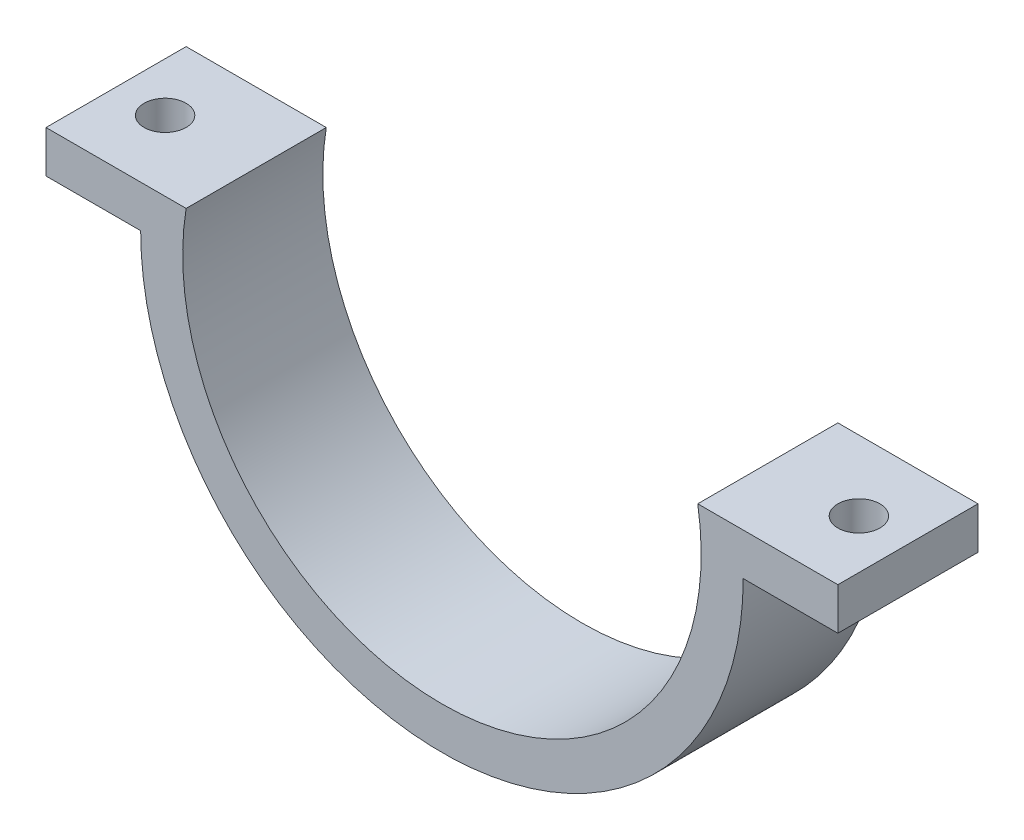
ISO-10303-21;
HEADER;
FILE_DESCRIPTION(('STEP AP214'),'2;1');
FILE_NAME('part.step','',(''),(''),'','','');
FILE_SCHEMA(('AUTOMOTIVE_DESIGN { 1 0 10303 214 1 1 1 1 }'));
ENDSEC;
DATA;
#1=APPLICATION_CONTEXT('core data for automotive mechanical design processes');
#2=APPLICATION_PROTOCOL_DEFINITION('international standard','automotive_design',2000,#1);
#3=PRODUCT_CONTEXT('',#1,'mechanical');
#4=PRODUCT('Part','Part','',(#3));
#5=PRODUCT_RELATED_PRODUCT_CATEGORY('part','',(#4));
#6=PRODUCT_DEFINITION_FORMATION('','',#4);
#7=PRODUCT_DEFINITION_CONTEXT('part definition',#1,'design');
#8=PRODUCT_DEFINITION('design','',#6,#7);
#9=PRODUCT_DEFINITION_SHAPE('','',#8);
#10=(LENGTH_UNIT() NAMED_UNIT(*) SI_UNIT(.MILLI.,.METRE.));
#11=(NAMED_UNIT(*) PLANE_ANGLE_UNIT() SI_UNIT($,.RADIAN.));
#12=(NAMED_UNIT(*) SI_UNIT($,.STERADIAN.) SOLID_ANGLE_UNIT());
#13=UNCERTAINTY_MEASURE_WITH_UNIT(LENGTH_MEASURE(1.E-05),#10,'distance_accuracy_value','');
#14=(GEOMETRIC_REPRESENTATION_CONTEXT(3) GLOBAL_UNCERTAINTY_ASSIGNED_CONTEXT((#13)) GLOBAL_UNIT_ASSIGNED_CONTEXT((#10,
#11,#12)) REPRESENTATION_CONTEXT('',''));
#15=CARTESIAN_POINT('',(0.,0.,0.));
#16=DIRECTION('',(0.,0.,1.));
#17=DIRECTION('',(1.,0.,0.));
#18=AXIS2_PLACEMENT_3D('',#15,#16,#17);
#19=CARTESIAN_POINT('',(0.,0.,10.));
#20=DIRECTION('',(0.,1.,0.));
#21=DIRECTION('',(0.,0.,1.));
#22=AXIS2_PLACEMENT_3D('',#19,#20,#21);
#23=PLANE('',#22);
#24=CARTESIAN_POINT('',(-24.7551362635287,0.,5.));
#25=DIRECTION('',(0.,1.,0.));
#26=DIRECTION('',(0.,0.,1.));
#27=AXIS2_PLACEMENT_3D('',#24,#25,#26);
#28=CIRCLE('',#27,1.5);
#29=CARTESIAN_POINT('',(-24.7551362635287,0.,6.5));
#30=VERTEX_POINT('',#29);
#31=EDGE_CURVE('E144',#30,#30,#28,.F.);
#32=ORIENTED_EDGE('',*,*,#31,.F.);
#33=EDGE_LOOP('',(#32));
#34=FACE_BOUND('',#33,.T.);
#35=DIRECTION('',(1.,0.,0.));
#36=VECTOR('',#35,1.);
#37=CARTESIAN_POINT('',(0.,0.,0.));
#38=LINE('',#37,#36);
#39=CARTESIAN_POINT('',(-28.2551362635287,0.,0.));
#40=VERTEX_POINT('',#39);
#41=CARTESIAN_POINT('',(-21.5,0.,0.));
#42=VERTEX_POINT('',#41);
#43=EDGE_CURVE('E140',#40,#42,#38,.T.);
#44=ORIENTED_EDGE('',*,*,#43,.T.);
#45=DIRECTION('',(0.,0.,-1.));
#46=VECTOR('',#45,1.);
#47=CARTESIAN_POINT('',(-21.5,0.,10.));
#48=LINE('',#47,#46);
#49=CARTESIAN_POINT('',(-21.5,0.,10.));
#50=VERTEX_POINT('',#49);
#51=EDGE_CURVE('E11',#50,#42,#48,.T.);
#52=ORIENTED_EDGE('',*,*,#51,.F.);
#53=DIRECTION('',(1.,0.,0.));
#54=VECTOR('',#53,1.);
#55=CARTESIAN_POINT('',(0.,0.,10.));
#56=LINE('',#55,#54);
#57=CARTESIAN_POINT('',(-28.2551362635287,0.,10.));
#58=VERTEX_POINT('',#57);
#59=EDGE_CURVE('E159',#58,#50,#56,.T.);
#60=ORIENTED_EDGE('',*,*,#59,.F.);
#61=DIRECTION('',(0.,0.,-1.));
#62=VECTOR('',#61,1.);
#63=CARTESIAN_POINT('',(-28.2551362635287,0.,10.));
#64=LINE('',#63,#62);
#65=EDGE_CURVE('E139',#58,#40,#64,.T.);
#66=ORIENTED_EDGE('',*,*,#65,.T.);
#67=EDGE_LOOP('',(#44,#52,#60,#66));
#68=FACE_BOUND('',#67,.T.);
#69=ADVANCED_FACE('F42',(#34,#68),#23,.F.);
#70=CARTESIAN_POINT('',(0.,0.,10.));
#71=DIRECTION('',(0.,0.,-1.));
#72=DIRECTION('',(-1.,0.,0.));
#73=AXIS2_PLACEMENT_3D('',#70,#71,#72);
#74=CYLINDRICAL_SURFACE('',#73,21.5);
#75=CARTESIAN_POINT('',(0.,0.,0.));
#76=DIRECTION('',(0.,0.,1.));
#77=DIRECTION('',(1.,0.,0.));
#78=AXIS2_PLACEMENT_3D('',#75,#76,#77);
#79=CIRCLE('',#78,21.5);
#80=CARTESIAN_POINT('',(21.5,0.,0.));
#81=VERTEX_POINT('',#80);
#82=EDGE_CURVE('E143',#42,#81,#79,.T.);
#83=ORIENTED_EDGE('',*,*,#82,.T.);
#84=DIRECTION('',(0.,0.,-1.));
#85=VECTOR('',#84,1.);
#86=CARTESIAN_POINT('',(21.5,0.,10.));
#87=LINE('',#86,#85);
#88=CARTESIAN_POINT('',(21.5,0.,10.));
#89=VERTEX_POINT('',#88);
#90=EDGE_CURVE('E50',#89,#81,#87,.T.);
#91=ORIENTED_EDGE('',*,*,#90,.F.);
#92=CARTESIAN_POINT('',(0.,0.,10.));
#93=DIRECTION('',(0.,0.,1.));
#94=DIRECTION('',(1.,0.,0.));
#95=AXIS2_PLACEMENT_3D('',#92,#93,#94);
#96=CIRCLE('',#95,21.5);
#97=EDGE_CURVE('E100',#50,#89,#96,.T.);
#98=ORIENTED_EDGE('',*,*,#97,.F.);
#99=ORIENTED_EDGE('',*,*,#51,.T.);
#100=EDGE_LOOP('',(#83,#91,#98,#99));
#101=FACE_BOUND('',#100,.T.);
#102=ADVANCED_FACE('F172',(#101),#74,.T.);
#103=CARTESIAN_POINT('',(0.,0.,10.));
#104=DIRECTION('',(0.,-1.,0.));
#105=DIRECTION('',(0.,0.,-1.));
#106=AXIS2_PLACEMENT_3D('',#103,#104,#105);
#107=PLANE('',#106);
#108=CARTESIAN_POINT('',(24.7551362635287,0.,5.));
#109=DIRECTION('',(0.,1.,0.));
#110=DIRECTION('',(0.,0.,1.));
#111=AXIS2_PLACEMENT_3D('',#108,#109,#110);
#112=CIRCLE('',#111,1.5);
#113=CARTESIAN_POINT('',(24.7551362635287,0.,6.5));
#114=VERTEX_POINT('',#113);
#115=EDGE_CURVE('E191',#114,#114,#112,.T.);
#116=ORIENTED_EDGE('',*,*,#115,.T.);
#117=EDGE_LOOP('',(#116));
#118=FACE_BOUND('',#117,.T.);
#119=DIRECTION('',(-1.,0.,0.));
#120=VECTOR('',#119,1.);
#121=CARTESIAN_POINT('',(0.,0.,0.));
#122=LINE('',#121,#120);
#123=CARTESIAN_POINT('',(28.2551362635287,0.,0.));
#124=VERTEX_POINT('',#123);
#125=EDGE_CURVE('E147',#124,#81,#122,.T.);
#126=ORIENTED_EDGE('',*,*,#125,.F.);
#127=DIRECTION('',(0.,0.,-1.));
#128=VECTOR('',#127,1.);
#129=CARTESIAN_POINT('',(28.2551362635287,0.,10.));
#130=LINE('',#129,#128);
#131=CARTESIAN_POINT('',(28.2551362635287,0.,10.));
#132=VERTEX_POINT('',#131);
#133=EDGE_CURVE('E165',#132,#124,#130,.T.);
#134=ORIENTED_EDGE('',*,*,#133,.F.);
#135=DIRECTION('',(-1.,0.,0.));
#136=VECTOR('',#135,1.);
#137=CARTESIAN_POINT('',(0.,0.,10.));
#138=LINE('',#137,#136);
#139=EDGE_CURVE('E171',#132,#89,#138,.T.);
#140=ORIENTED_EDGE('',*,*,#139,.T.);
#141=ORIENTED_EDGE('',*,*,#90,.T.);
#142=EDGE_LOOP('',(#126,#134,#140,#141));
#143=FACE_BOUND('',#142,.T.);
#144=ADVANCED_FACE('F169',(#118,#143),#107,.T.);
#145=CARTESIAN_POINT('',(28.2551362635287,0.,10.));
#146=DIRECTION('',(1.,0.,0.));
#147=DIRECTION('',(0.,0.,-1.));
#148=AXIS2_PLACEMENT_3D('',#145,#146,#147);
#149=PLANE('',#148);
#150=DIRECTION('',(0.,-1.,0.));
#151=VECTOR('',#150,1.);
#152=CARTESIAN_POINT('',(28.2551362635287,0.,0.));
#153=LINE('',#152,#151);
#154=CARTESIAN_POINT('',(28.2551362635287,3.,0.));
#155=VERTEX_POINT('',#154);
#156=EDGE_CURVE('E150',#155,#124,#153,.T.);
#157=ORIENTED_EDGE('',*,*,#156,.F.);
#158=DIRECTION('',(0.,0.,-1.));
#159=VECTOR('',#158,1.);
#160=CARTESIAN_POINT('',(28.2551362635287,3.,10.));
#161=LINE('',#160,#159);
#162=CARTESIAN_POINT('',(28.2551362635287,3.,10.));
#163=VERTEX_POINT('',#162);
#164=EDGE_CURVE('E163',#163,#155,#161,.T.);
#165=ORIENTED_EDGE('',*,*,#164,.F.);
#166=DIRECTION('',(0.,-1.,0.));
#167=VECTOR('',#166,1.);
#168=CARTESIAN_POINT('',(28.2551362635287,0.,10.));
#169=LINE('',#168,#167);
#170=EDGE_CURVE('E134',#163,#132,#169,.T.);
#171=ORIENTED_EDGE('',*,*,#170,.T.);
#172=ORIENTED_EDGE('',*,*,#133,.T.);
#173=EDGE_LOOP('',(#157,#165,#171,#172));
#174=FACE_BOUND('',#173,.T.);
#175=ADVANCED_FACE('F180',(#174),#149,.T.);
#176=CARTESIAN_POINT('',(0.,3.00000000000001,10.));
#177=DIRECTION('',(0.,1.,0.));
#178=DIRECTION('',(-1.,0.,0.));
#179=AXIS2_PLACEMENT_3D('',#176,#177,#178);
#180=PLANE('',#179);
#181=CARTESIAN_POINT('',(24.7551362635287,3.,5.));
#182=DIRECTION('',(0.,-1.,0.));
#183=DIRECTION('',(1.,0.,0.));
#184=AXIS2_PLACEMENT_3D('',#181,#182,#183);
#185=CIRCLE('',#184,1.5);
#186=CARTESIAN_POINT('',(26.2551362635287,3.,5.));
#187=VERTEX_POINT('',#186);
#188=EDGE_CURVE('E194',#187,#187,#185,.T.);
#189=ORIENTED_EDGE('',*,*,#188,.T.);
#190=EDGE_LOOP('',(#189));
#191=FACE_BOUND('',#190,.T.);
#192=DIRECTION('',(1.,0.,0.));
#193=VECTOR('',#192,1.);
#194=CARTESIAN_POINT('',(0.,3.00000000000001,0.));
#195=LINE('',#194,#193);
#196=CARTESIAN_POINT('',(18.2551362635287,3.,0.));
#197=VERTEX_POINT('',#196);
#198=EDGE_CURVE('E153',#197,#155,#195,.T.);
#199=ORIENTED_EDGE('',*,*,#198,.F.);
#200=DIRECTION('',(0.,0.,-1.));
#201=VECTOR('',#200,1.);
#202=CARTESIAN_POINT('',(18.2551362635287,3.,10.));
#203=LINE('',#202,#201);
#204=CARTESIAN_POINT('',(18.2551362635287,3.,10.));
#205=VERTEX_POINT('',#204);
#206=EDGE_CURVE('E122',#205,#197,#203,.T.);
#207=ORIENTED_EDGE('',*,*,#206,.F.);
#208=DIRECTION('',(1.,0.,0.));
#209=VECTOR('',#208,1.);
#210=CARTESIAN_POINT('',(0.,3.00000000000001,10.));
#211=LINE('',#210,#209);
#212=EDGE_CURVE('E132',#205,#163,#211,.T.);
#213=ORIENTED_EDGE('',*,*,#212,.T.);
#214=ORIENTED_EDGE('',*,*,#164,.T.);
#215=EDGE_LOOP('',(#199,#207,#213,#214));
#216=FACE_BOUND('',#215,.T.);
#217=ADVANCED_FACE('F198',(#191,#216),#180,.T.);
#218=CARTESIAN_POINT('',(0.,0.,10.));
#219=DIRECTION('',(0.,0.,-1.));
#220=DIRECTION('',(-1.,0.,0.));
#221=AXIS2_PLACEMENT_3D('',#218,#219,#220);
#222=CYLINDRICAL_SURFACE('',#221,18.5);
#223=CARTESIAN_POINT('',(0.,0.,0.));
#224=DIRECTION('',(0.,0.,1.));
#225=DIRECTION('',(1.,0.,0.));
#226=AXIS2_PLACEMENT_3D('',#223,#224,#225);
#227=CIRCLE('',#226,18.5);
#228=CARTESIAN_POINT('',(-18.2551362635287,3.,0.));
#229=VERTEX_POINT('',#228);
#230=EDGE_CURVE('E121',#229,#197,#227,.T.);
#231=ORIENTED_EDGE('',*,*,#230,.F.);
#232=DIRECTION('',(0.,0.,-1.));
#233=VECTOR('',#232,1.);
#234=CARTESIAN_POINT('',(-18.2551362635287,3.,10.));
#235=LINE('',#234,#233);
#236=CARTESIAN_POINT('',(-18.2551362635287,3.,10.));
#237=VERTEX_POINT('',#236);
#238=EDGE_CURVE('E115',#237,#229,#235,.T.);
#239=ORIENTED_EDGE('',*,*,#238,.F.);
#240=CARTESIAN_POINT('',(0.,0.,10.));
#241=DIRECTION('',(0.,0.,1.));
#242=DIRECTION('',(1.,0.,0.));
#243=AXIS2_PLACEMENT_3D('',#240,#241,#242);
#244=CIRCLE('',#243,18.5);
#245=EDGE_CURVE('E119',#237,#205,#244,.T.);
#246=ORIENTED_EDGE('',*,*,#245,.T.);
#247=ORIENTED_EDGE('',*,*,#206,.T.);
#248=EDGE_LOOP('',(#231,#239,#246,#247));
#249=FACE_BOUND('',#248,.T.);
#250=ADVANCED_FACE('F117',(#249),#222,.F.);
#251=CARTESIAN_POINT('',(0.,3.00000000000001,10.));
#252=DIRECTION('',(0.,-1.,0.));
#253=DIRECTION('',(1.,0.,0.));
#254=AXIS2_PLACEMENT_3D('',#251,#252,#253);
#255=PLANE('',#254);
#256=CARTESIAN_POINT('',(-24.7551362635287,3.,5.));
#257=DIRECTION('',(0.,1.,0.));
#258=DIRECTION('',(-1.,0.,0.));
#259=AXIS2_PLACEMENT_3D('',#256,#257,#258);
#260=CIRCLE('',#259,1.5);
#261=CARTESIAN_POINT('',(-26.2551362635287,3.,5.));
#262=VERTEX_POINT('',#261);
#263=EDGE_CURVE('E188',#262,#262,#260,.T.);
#264=ORIENTED_EDGE('',*,*,#263,.F.);
#265=EDGE_LOOP('',(#264));
#266=FACE_BOUND('',#265,.T.);
#267=DIRECTION('',(-1.,0.,0.));
#268=VECTOR('',#267,1.);
#269=CARTESIAN_POINT('',(0.,3.00000000000001,0.));
#270=LINE('',#269,#268);
#271=CARTESIAN_POINT('',(-28.2551362635287,3.,0.));
#272=VERTEX_POINT('',#271);
#273=EDGE_CURVE('E86',#229,#272,#270,.T.);
#274=ORIENTED_EDGE('',*,*,#273,.T.);
#275=DIRECTION('',(0.,0.,-1.));
#276=VECTOR('',#275,1.);
#277=CARTESIAN_POINT('',(-28.2551362635287,3.,10.));
#278=LINE('',#277,#276);
#279=CARTESIAN_POINT('',(-28.2551362635287,3.,10.));
#280=VERTEX_POINT('',#279);
#281=EDGE_CURVE('E123',#280,#272,#278,.T.);
#282=ORIENTED_EDGE('',*,*,#281,.F.);
#283=DIRECTION('',(-1.,0.,0.));
#284=VECTOR('',#283,1.);
#285=CARTESIAN_POINT('',(0.,3.00000000000001,10.));
#286=LINE('',#285,#284);
#287=EDGE_CURVE('E125',#237,#280,#286,.T.);
#288=ORIENTED_EDGE('',*,*,#287,.F.);
#289=ORIENTED_EDGE('',*,*,#238,.T.);
#290=EDGE_LOOP('',(#274,#282,#288,#289));
#291=FACE_BOUND('',#290,.T.);
#292=ADVANCED_FACE('F126',(#266,#291),#255,.F.);
#293=CARTESIAN_POINT('',(-28.2551362635287,0.,10.));
#294=DIRECTION('',(1.,0.,0.));
#295=DIRECTION('',(0.,0.,-1.));
#296=AXIS2_PLACEMENT_3D('',#293,#294,#295);
#297=PLANE('',#296);
#298=DIRECTION('',(0.,-1.,0.));
#299=VECTOR('',#298,1.);
#300=CARTESIAN_POINT('',(-28.2551362635287,0.,0.));
#301=LINE('',#300,#299);
#302=EDGE_CURVE('E92',#272,#40,#301,.T.);
#303=ORIENTED_EDGE('',*,*,#302,.T.);
#304=ORIENTED_EDGE('',*,*,#65,.F.);
#305=DIRECTION('',(0.,-1.,0.));
#306=VECTOR('',#305,1.);
#307=CARTESIAN_POINT('',(-28.2551362635287,0.,10.));
#308=LINE('',#307,#306);
#309=EDGE_CURVE('E58',#280,#58,#308,.T.);
#310=ORIENTED_EDGE('',*,*,#309,.F.);
#311=ORIENTED_EDGE('',*,*,#281,.T.);
#312=EDGE_LOOP('',(#303,#304,#310,#311));
#313=FACE_BOUND('',#312,.T.);
#314=ADVANCED_FACE('F223',(#313),#297,.F.);
#315=CARTESIAN_POINT('',(0.,0.,10.));
#316=DIRECTION('',(0.,0.,1.));
#317=DIRECTION('',(1.,0.,0.));
#318=AXIS2_PLACEMENT_3D('',#315,#316,#317);
#319=PLANE('',#318);
#320=ORIENTED_EDGE('',*,*,#59,.T.);
#321=ORIENTED_EDGE('',*,*,#97,.T.);
#322=ORIENTED_EDGE('',*,*,#139,.F.);
#323=ORIENTED_EDGE('',*,*,#170,.F.);
#324=ORIENTED_EDGE('',*,*,#212,.F.);
#325=ORIENTED_EDGE('',*,*,#245,.F.);
#326=ORIENTED_EDGE('',*,*,#287,.T.);
#327=ORIENTED_EDGE('',*,*,#309,.T.);
#328=EDGE_LOOP('',(#320,#321,#322,#323,#324,#325,#326,#327));
#329=FACE_BOUND('',#328,.T.);
#330=ADVANCED_FACE('F129',(#329),#319,.T.);
#331=CARTESIAN_POINT('',(0.,0.,0.));
#332=DIRECTION('',(0.,0.,1.));
#333=DIRECTION('',(1.,0.,0.));
#334=AXIS2_PLACEMENT_3D('',#331,#332,#333);
#335=PLANE('',#334);
#336=ORIENTED_EDGE('',*,*,#43,.F.);
#337=ORIENTED_EDGE('',*,*,#302,.F.);
#338=ORIENTED_EDGE('',*,*,#273,.F.);
#339=ORIENTED_EDGE('',*,*,#230,.T.);
#340=ORIENTED_EDGE('',*,*,#198,.T.);
#341=ORIENTED_EDGE('',*,*,#156,.T.);
#342=ORIENTED_EDGE('',*,*,#125,.T.);
#343=ORIENTED_EDGE('',*,*,#82,.F.);
#344=EDGE_LOOP('',(#336,#337,#338,#339,#340,#341,#342,#343));
#345=FACE_BOUND('',#344,.T.);
#346=ADVANCED_FACE('F176',(#345),#335,.F.);
#347=CARTESIAN_POINT('',(-24.7551362635287,-4.24264068711929,5.));
#348=DIRECTION('',(0.,1.,0.));
#349=DIRECTION('',(-1.,0.,0.));
#350=AXIS2_PLACEMENT_3D('',#347,#348,#349);
#351=CYLINDRICAL_SURFACE('',#350,1.5);
#352=ORIENTED_EDGE('',*,*,#31,.T.);
#353=EDGE_LOOP('',(#352));
#354=FACE_BOUND('',#353,.T.);
#355=ORIENTED_EDGE('',*,*,#263,.T.);
#356=EDGE_LOOP('',(#355));
#357=FACE_BOUND('',#356,.T.);
#358=ADVANCED_FACE('F203',(#354,#357),#351,.F.);
#359=CARTESIAN_POINT('',(24.7551362635287,-4.24264068711929,5.));
#360=DIRECTION('',(0.,1.,0.));
#361=DIRECTION('',(-1.,0.,0.));
#362=AXIS2_PLACEMENT_3D('',#359,#360,#361);
#363=CYLINDRICAL_SURFACE('',#362,1.5);
#364=ORIENTED_EDGE('',*,*,#115,.F.);
#365=EDGE_LOOP('',(#364));
#366=FACE_BOUND('',#365,.T.);
#367=ORIENTED_EDGE('',*,*,#188,.F.);
#368=EDGE_LOOP('',(#367));
#369=FACE_BOUND('',#368,.T.);
#370=ADVANCED_FACE('F201',(#366,#369),#363,.F.);
#371=CLOSED_SHELL('',(#69,#102,#144,#175,#217,#250,#292,#314,#330,#346,#358,#370));
#372=MANIFOLD_SOLID_BREP('B2',#371);
#373=ADVANCED_BREP_SHAPE_REPRESENTATION('',(#18,#372),#14);
#374=SHAPE_DEFINITION_REPRESENTATION(#9,#373);
ENDSEC;
END-ISO-10303-21;
